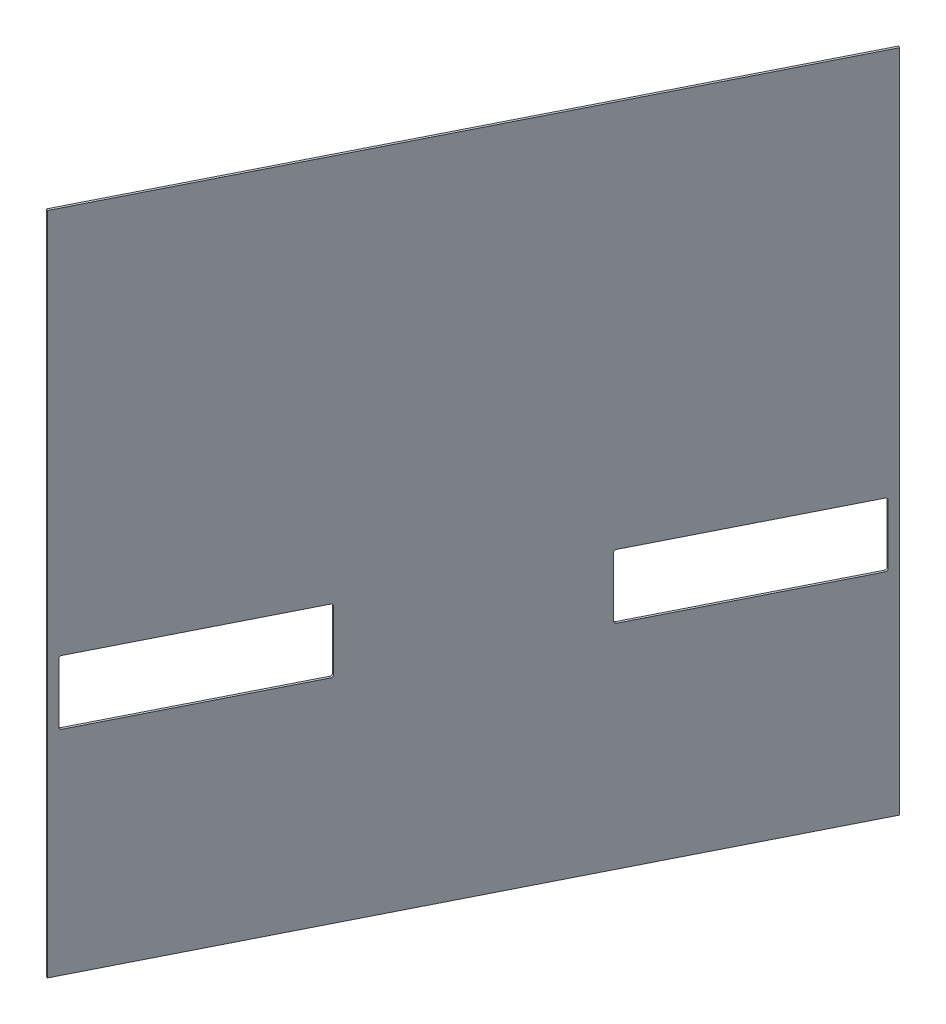
ISO-10303-21;
HEADER;
FILE_DESCRIPTION(('STEP AP214'),'2;1');
FILE_NAME('part.step','',(''),(''),'','','');
FILE_SCHEMA(('AUTOMOTIVE_DESIGN { 1 0 10303 214 1 1 1 1 }'));
ENDSEC;
DATA;
#1=APPLICATION_CONTEXT('core data for automotive mechanical design processes');
#2=APPLICATION_PROTOCOL_DEFINITION('international standard','automotive_design',2000,#1);
#3=PRODUCT_CONTEXT('',#1,'mechanical');
#4=PRODUCT('Part','Part','',(#3));
#5=PRODUCT_RELATED_PRODUCT_CATEGORY('part','',(#4));
#6=PRODUCT_DEFINITION_FORMATION('','',#4);
#7=PRODUCT_DEFINITION_CONTEXT('part definition',#1,'design');
#8=PRODUCT_DEFINITION('design','',#6,#7);
#9=PRODUCT_DEFINITION_SHAPE('','',#8);
#10=(LENGTH_UNIT() NAMED_UNIT(*) SI_UNIT(.MILLI.,.METRE.));
#11=(NAMED_UNIT(*) PLANE_ANGLE_UNIT() SI_UNIT($,.RADIAN.));
#12=(NAMED_UNIT(*) SI_UNIT($,.STERADIAN.) SOLID_ANGLE_UNIT());
#13=UNCERTAINTY_MEASURE_WITH_UNIT(LENGTH_MEASURE(1.E-05),#10,'distance_accuracy_value','');
#14=(GEOMETRIC_REPRESENTATION_CONTEXT(3) GLOBAL_UNCERTAINTY_ASSIGNED_CONTEXT((#13)) GLOBAL_UNIT_ASSIGNED_CONTEXT((#10,
#11,#12)) REPRESENTATION_CONTEXT('',''));
#15=CARTESIAN_POINT('',(0.,0.,0.));
#16=DIRECTION('',(0.,0.,1.));
#17=DIRECTION('',(1.,0.,0.));
#18=AXIS2_PLACEMENT_3D('',#15,#16,#17);
#19=CARTESIAN_POINT('',(-4206.67465586528,6.34999999999986,-7750.89939772489));
#20=DIRECTION('',(0.,-1.,0.));
#21=DIRECTION('',(0.,0.,-1.));
#22=AXIS2_PLACEMENT_3D('',#19,#20,#21);
#23=PLANE('',#22);
#24=DIRECTION('',(0.893517841167983,0.,0.449027691255792));
#25=VECTOR('',#24,1.);
#26=CARTESIAN_POINT('',(-4206.67465586528,6.34999999999986,-7750.89939772489));
#27=LINE('',#26,#25);
#28=CARTESIAN_POINT('',(-1758.70437432777,6.34999999999986,-6520.69850733782));
#29=VERTEX_POINT('',#28);
#30=CARTESIAN_POINT('',(-1753.03053603635,6.34999999999986,-6517.84718149835));
#31=VERTEX_POINT('',#30);
#32=EDGE_CURVE('E235',#29,#31,#27,.T.);
#33=ORIENTED_EDGE('',*,*,#32,.F.);
#34=DIRECTION('',(0.449027691255792,0.,-0.893517841167983));
#35=VECTOR('',#34,1.);
#36=CARTESIAN_POINT('',(-1758.70437432777,6.34999999999986,-6520.69850733782));
#37=LINE('',#36,#35);
#38=CARTESIAN_POINT('',(-909.009274164434,6.34999999999986,-8211.50231818));
#39=VERTEX_POINT('',#38);
#40=EDGE_CURVE('E146',#29,#39,#37,.T.);
#41=ORIENTED_EDGE('',*,*,#40,.T.);
#42=DIRECTION('',(0.893517841167983,0.,0.449027691255792));
#43=VECTOR('',#42,1.);
#44=CARTESIAN_POINT('',(-3356.97955570195,6.34999999999986,-9441.70320856706));
#45=LINE('',#44,#43);
#46=CARTESIAN_POINT('',(-903.335435873017,6.34999999999986,-8208.65099234052));
#47=VERTEX_POINT('',#46);
#48=EDGE_CURVE('E231',#39,#47,#45,.T.);
#49=ORIENTED_EDGE('',*,*,#48,.T.);
#50=DIRECTION('',(0.449027691255792,0.,-0.893517841167983));
#51=VECTOR('',#50,1.);
#52=CARTESIAN_POINT('',(-1753.03053603635,6.34999999999986,-6517.84718149835));
#53=LINE('',#52,#51);
#54=EDGE_CURVE('E180',#31,#47,#53,.T.);
#55=ORIENTED_EDGE('',*,*,#54,.F.);
#56=EDGE_LOOP('',(#33,#41,#49,#55));
#57=FACE_BOUND('',#56,.T.);
#58=ADVANCED_FACE('F33',(#57),#23,.T.);
#59=CARTESIAN_POINT('',(-4206.67465586528,1987.55,-7750.89939772489));
#60=DIRECTION('',(-0.449027691255792,0.,0.893517841167983));
#61=DIRECTION('',(0.893517841167983,0.,0.449027691255792));
#62=AXIS2_PLACEMENT_3D('',#59,#60,#61);
#63=PLANE('',#62);
#64=DIRECTION('',(0.893517841167983,0.,0.449027691255792));
#65=VECTOR('',#64,1.);
#66=CARTESIAN_POINT('',(-4206.67465586528,1987.55,-7750.89939772489));
#67=LINE('',#66,#65);
#68=CARTESIAN_POINT('',(-1758.70437432777,1987.55,-6520.69850733782));
#69=VERTEX_POINT('',#68);
#70=CARTESIAN_POINT('',(-1753.03053603635,1987.55,-6517.84718149835));
#71=VERTEX_POINT('',#70);
#72=EDGE_CURVE('E190',#69,#71,#67,.T.);
#73=ORIENTED_EDGE('',*,*,#72,.F.);
#74=DIRECTION('',(0.,-1.,0.));
#75=VECTOR('',#74,1.);
#76=CARTESIAN_POINT('',(-1758.70437432777,1987.55,-6520.69850733782));
#77=LINE('',#76,#75);
#78=EDGE_CURVE('E232',#69,#29,#77,.T.);
#79=ORIENTED_EDGE('',*,*,#78,.T.);
#80=ORIENTED_EDGE('',*,*,#32,.T.);
#81=DIRECTION('',(0.,-1.,0.));
#82=VECTOR('',#81,1.);
#83=CARTESIAN_POINT('',(-1753.03053603635,1987.55,-6517.84718149835));
#84=LINE('',#83,#82);
#85=EDGE_CURVE('E215',#71,#31,#84,.T.);
#86=ORIENTED_EDGE('',*,*,#85,.F.);
#87=EDGE_LOOP('',(#73,#79,#80,#86));
#88=FACE_BOUND('',#87,.T.);
#89=ADVANCED_FACE('F329',(#88),#63,.T.);
#90=CARTESIAN_POINT('',(-3781.82710578362,1987.55,-8596.30130314597));
#91=DIRECTION('',(0.,1.,0.));
#92=DIRECTION('',(0.,0.,1.));
#93=AXIS2_PLACEMENT_3D('',#90,#91,#92);
#94=PLANE('',#93);
#95=DIRECTION('',(0.893517841167983,0.,0.449027691255792));
#96=VECTOR('',#95,1.);
#97=CARTESIAN_POINT('',(-3356.97955570195,1987.55,-9441.70320856706));
#98=LINE('',#97,#96);
#99=CARTESIAN_POINT('',(-909.009274164435,1987.55,-8211.50231818));
#100=VERTEX_POINT('',#99);
#101=CARTESIAN_POINT('',(-903.335435873017,1987.55,-8208.65099234052));
#102=VERTEX_POINT('',#101);
#103=EDGE_CURVE('E189',#100,#102,#98,.T.);
#104=ORIENTED_EDGE('',*,*,#103,.F.);
#105=DIRECTION('',(-0.449027691255792,0.,0.893517841167983));
#106=VECTOR('',#105,1.);
#107=CARTESIAN_POINT('',(-1333.8568242461,1987.55,-7366.10041275891));
#108=LINE('',#107,#106);
#109=EDGE_CURVE('E236',#100,#69,#108,.T.);
#110=ORIENTED_EDGE('',*,*,#109,.T.);
#111=ORIENTED_EDGE('',*,*,#72,.T.);
#112=DIRECTION('',(-0.449027691255792,0.,0.893517841167983));
#113=VECTOR('',#112,1.);
#114=CARTESIAN_POINT('',(-1328.18298595468,1987.55,-7363.24908691944));
#115=LINE('',#114,#113);
#116=EDGE_CURVE('E311',#102,#71,#115,.T.);
#117=ORIENTED_EDGE('',*,*,#116,.F.);
#118=EDGE_LOOP('',(#104,#110,#111,#117));
#119=FACE_BOUND('',#118,.T.);
#120=ADVANCED_FACE('F328',(#119),#94,.T.);
#121=CARTESIAN_POINT('',(-3356.97955570195,6.34999999999986,-9441.70320856706));
#122=DIRECTION('',(0.449027691255792,0.,-0.893517841167983));
#123=DIRECTION('',(-0.893517841167983,0.,-0.449027691255792));
#124=AXIS2_PLACEMENT_3D('',#121,#122,#123);
#125=PLANE('',#124);
#126=ORIENTED_EDGE('',*,*,#48,.F.);
#127=DIRECTION('',(0.,1.,0.));
#128=VECTOR('',#127,1.);
#129=CARTESIAN_POINT('',(-909.009274164434,6.34999999999986,-8211.50231818));
#130=LINE('',#129,#128);
#131=EDGE_CURVE('E52',#39,#100,#130,.T.);
#132=ORIENTED_EDGE('',*,*,#131,.T.);
#133=ORIENTED_EDGE('',*,*,#103,.T.);
#134=DIRECTION('',(0.,1.,0.));
#135=VECTOR('',#134,1.);
#136=CARTESIAN_POINT('',(-903.335435873017,6.34999999999986,-8208.65099234052));
#137=LINE('',#136,#135);
#138=EDGE_CURVE('E183',#47,#102,#137,.T.);
#139=ORIENTED_EDGE('',*,*,#138,.F.);
#140=EDGE_LOOP('',(#126,#132,#133,#139));
#141=FACE_BOUND('',#140,.T.);
#142=ADVANCED_FACE('F325',(#141),#125,.T.);
#143=CARTESIAN_POINT('',(-3639.2608138099,647.7,-8879.99321771681));
#144=DIRECTION('',(0.893517841167983,0.,0.449027691255792));
#145=DIRECTION('',(0.449027691255792,0.,-0.893517841167983));
#146=AXIS2_PLACEMENT_3D('',#143,#144,#145);
#147=CYLINDRICAL_SURFACE('',#146,6.35000000000012);
#148=CARTESIAN_POINT('',(-1191.29053227239,647.7,-7649.79232732974));
#149=DIRECTION('',(-0.893517841167983,0.,-0.449027691255792));
#150=DIRECTION('',(-0.449027691255792,0.,0.893517841167983));
#151=AXIS2_PLACEMENT_3D('',#148,#149,#150);
#152=CIRCLE('',#151,6.35000000000012);
#153=CARTESIAN_POINT('',(-1194.14185811186,647.7,-7644.11848903833));
#154=VERTEX_POINT('',#153);
#155=CARTESIAN_POINT('',(-1191.29053227239,641.35,-7649.79232732974));
#156=VERTEX_POINT('',#155);
#157=EDGE_CURVE('E191',#154,#156,#152,.F.);
#158=ORIENTED_EDGE('',*,*,#157,.F.);
#159=DIRECTION('',(0.893517841167983,0.,0.449027691255792));
#160=VECTOR('',#159,1.);
#161=CARTESIAN_POINT('',(-3642.11213964938,647.7,-8874.31937942539));
#162=LINE('',#161,#160);
#163=CARTESIAN_POINT('',(-1188.46801982045,647.7,-7641.26716319885));
#164=VERTEX_POINT('',#163);
#165=EDGE_CURVE('E245',#154,#164,#162,.T.);
#166=ORIENTED_EDGE('',*,*,#165,.T.);
#167=CARTESIAN_POINT('',(-1185.61669398097,647.7,-7646.94100149027));
#168=DIRECTION('',(0.893517841167983,0.,0.449027691255792));
#169=DIRECTION('',(0.449027691255792,0.,-0.893517841167983));
#170=AXIS2_PLACEMENT_3D('',#167,#168,#169);
#171=CIRCLE('',#170,6.35000000000012);
#172=CARTESIAN_POINT('',(-1185.61669398097,641.35,-7646.94100149027));
#173=VERTEX_POINT('',#172);
#174=EDGE_CURVE('E248',#164,#173,#171,.T.);
#175=ORIENTED_EDGE('',*,*,#174,.T.);
#176=DIRECTION('',(0.893517841167983,0.,0.449027691255792));
#177=VECTOR('',#176,1.);
#178=CARTESIAN_POINT('',(-3639.2608138099,641.35,-8879.99321771681));
#179=LINE('',#178,#177);
#180=EDGE_CURVE('E75',#156,#173,#179,.T.);
#181=ORIENTED_EDGE('',*,*,#180,.F.);
#182=EDGE_LOOP('',(#158,#166,#175,#181));
#183=FACE_BOUND('',#182,.T.);
#184=ADVANCED_FACE('F353',(#183),#147,.F.);
#185=CARTESIAN_POINT('',(-3642.11213964938,825.5,-8874.31937942539));
#186=DIRECTION('',(-0.449027691255792,0.,0.893517841167983));
#187=DIRECTION('',(0.893517841167983,0.,0.449027691255792));
#188=AXIS2_PLACEMENT_3D('',#185,#186,#187);
#189=PLANE('',#188);
#190=DIRECTION('',(0.,-1.,0.));
#191=VECTOR('',#190,1.);
#192=CARTESIAN_POINT('',(-1194.14185811186,825.5,-7644.11848903833));
#193=LINE('',#192,#191);
#194=CARTESIAN_POINT('',(-1194.14185811186,825.5,-7644.11848903833));
#195=VERTEX_POINT('',#194);
#196=EDGE_CURVE('E195',#195,#154,#193,.T.);
#197=ORIENTED_EDGE('',*,*,#196,.F.);
#198=DIRECTION('',(0.893517841167983,0.,0.449027691255792));
#199=VECTOR('',#198,1.);
#200=CARTESIAN_POINT('',(-3642.11213964938,825.5,-8874.31937942539));
#201=LINE('',#200,#199);
#202=CARTESIAN_POINT('',(-1188.46801982045,825.5,-7641.26716319885));
#203=VERTEX_POINT('',#202);
#204=EDGE_CURVE('E249',#195,#203,#201,.T.);
#205=ORIENTED_EDGE('',*,*,#204,.T.);
#206=DIRECTION('',(0.,-1.,0.));
#207=VECTOR('',#206,1.);
#208=CARTESIAN_POINT('',(-1188.46801982045,825.5,-7641.26716319885));
#209=LINE('',#208,#207);
#210=EDGE_CURVE('E251',#203,#164,#209,.T.);
#211=ORIENTED_EDGE('',*,*,#210,.T.);
#212=ORIENTED_EDGE('',*,*,#165,.F.);
#213=EDGE_LOOP('',(#197,#205,#211,#212));
#214=FACE_BOUND('',#213,.T.);
#215=ADVANCED_FACE('F341',(#214),#189,.F.);
#216=CARTESIAN_POINT('',(-3639.2608138099,825.5,-8879.99321771681));
#217=DIRECTION('',(0.893517841167983,0.,0.449027691255792));
#218=DIRECTION('',(0.449027691255792,0.,-0.893517841167983));
#219=AXIS2_PLACEMENT_3D('',#216,#217,#218);
#220=CYLINDRICAL_SURFACE('',#219,6.35);
#221=CARTESIAN_POINT('',(-1191.29053227239,825.5,-7649.79232732974));
#222=DIRECTION('',(-0.893517841167983,0.,-0.449027691255792));
#223=DIRECTION('',(-0.449027691255792,0.,0.893517841167983));
#224=AXIS2_PLACEMENT_3D('',#221,#222,#223);
#225=CIRCLE('',#224,6.35);
#226=CARTESIAN_POINT('',(-1191.29053227239,831.85,-7649.79232732974));
#227=VERTEX_POINT('',#226);
#228=EDGE_CURVE('E11',#227,#195,#225,.F.);
#229=ORIENTED_EDGE('',*,*,#228,.F.);
#230=DIRECTION('',(0.893517841167983,0.,0.449027691255792));
#231=VECTOR('',#230,1.);
#232=CARTESIAN_POINT('',(-3639.2608138099,831.85,-8879.99321771681));
#233=LINE('',#232,#231);
#234=CARTESIAN_POINT('',(-1185.61669398097,831.85,-7646.94100149027));
#235=VERTEX_POINT('',#234);
#236=EDGE_CURVE('E252',#227,#235,#233,.T.);
#237=ORIENTED_EDGE('',*,*,#236,.T.);
#238=CARTESIAN_POINT('',(-1185.61669398097,825.5,-7646.94100149027));
#239=DIRECTION('',(0.893517841167983,0.,0.449027691255792));
#240=DIRECTION('',(0.449027691255792,0.,-0.893517841167983));
#241=AXIS2_PLACEMENT_3D('',#238,#239,#240);
#242=CIRCLE('',#241,6.35);
#243=EDGE_CURVE('E254',#235,#203,#242,.T.);
#244=ORIENTED_EDGE('',*,*,#243,.T.);
#245=ORIENTED_EDGE('',*,*,#204,.F.);
#246=EDGE_LOOP('',(#229,#237,#244,#245));
#247=FACE_BOUND('',#246,.T.);
#248=ADVANCED_FACE('F344',(#247),#220,.F.);
#249=CARTESIAN_POINT('',(-3371.23618489932,831.85,-9413.33401710998));
#250=DIRECTION('',(0.,1.,0.));
#251=DIRECTION('',(0.,0.,1.));
#252=AXIS2_PLACEMENT_3D('',#249,#250,#251);
#253=PLANE('',#252);
#254=DIRECTION('',(-0.449027691255792,0.,0.893517841167983));
#255=VECTOR('',#254,1.);
#256=CARTESIAN_POINT('',(-923.265903361805,831.85,-8183.13312672291));
#257=LINE('',#256,#255);
#258=CARTESIAN_POINT('',(-923.265903361806,831.85,-8183.13312672291));
#259=VERTEX_POINT('',#258);
#260=EDGE_CURVE('E43',#259,#227,#257,.T.);
#261=ORIENTED_EDGE('',*,*,#260,.F.);
#262=DIRECTION('',(0.893517841167983,0.,0.449027691255792));
#263=VECTOR('',#262,1.);
#264=CARTESIAN_POINT('',(-3371.23618489932,831.85,-9413.33401710998));
#265=LINE('',#264,#263);
#266=CARTESIAN_POINT('',(-917.592065070389,831.85,-8180.28180088344));
#267=VERTEX_POINT('',#266);
#268=EDGE_CURVE('E255',#259,#267,#265,.T.);
#269=ORIENTED_EDGE('',*,*,#268,.T.);
#270=DIRECTION('',(-0.449027691255791,0.,0.893517841167984));
#271=VECTOR('',#270,1.);
#272=CARTESIAN_POINT('',(-917.592065070389,831.85,-8180.28180088344));
#273=LINE('',#272,#271);
#274=EDGE_CURVE('E257',#267,#235,#273,.T.);
#275=ORIENTED_EDGE('',*,*,#274,.T.);
#276=ORIENTED_EDGE('',*,*,#236,.F.);
#277=EDGE_LOOP('',(#261,#269,#275,#276));
#278=FACE_BOUND('',#277,.T.);
#279=ADVANCED_FACE('F424',(#278),#253,.F.);
#280=CARTESIAN_POINT('',(-3371.23618489932,825.5,-9413.33401710998));
#281=DIRECTION('',(0.893517841167983,0.,0.449027691255792));
#282=DIRECTION('',(0.449027691255792,0.,-0.893517841167983));
#283=AXIS2_PLACEMENT_3D('',#280,#281,#282);
#284=CYLINDRICAL_SURFACE('',#283,6.35000000000006);
#285=CARTESIAN_POINT('',(-923.265903361805,825.5,-8183.13312672291));
#286=DIRECTION('',(-0.893517841167983,0.,-0.449027691255792));
#287=DIRECTION('',(-0.449027691255792,0.,0.893517841167983));
#288=AXIS2_PLACEMENT_3D('',#285,#286,#287);
#289=CIRCLE('',#288,6.35000000000006);
#290=CARTESIAN_POINT('',(-920.414577522332,825.5,-8188.80696501433));
#291=VERTEX_POINT('',#290);
#292=EDGE_CURVE('E201',#291,#259,#289,.F.);
#293=ORIENTED_EDGE('',*,*,#292,.F.);
#294=DIRECTION('',(0.893517841167983,0.,0.449027691255792));
#295=VECTOR('',#294,1.);
#296=CARTESIAN_POINT('',(-3368.38485905985,825.5,-9419.00785540139));
#297=LINE('',#296,#295);
#298=CARTESIAN_POINT('',(-914.740739230914,825.5,-8185.95563917485));
#299=VERTEX_POINT('',#298);
#300=EDGE_CURVE('E258',#291,#299,#297,.T.);
#301=ORIENTED_EDGE('',*,*,#300,.T.);
#302=CARTESIAN_POINT('',(-917.592065070389,825.5,-8180.28180088344));
#303=DIRECTION('',(0.893517841167983,0.,0.449027691255792));
#304=DIRECTION('',(0.449027691255792,0.,-0.893517841167983));
#305=AXIS2_PLACEMENT_3D('',#302,#303,#304);
#306=CIRCLE('',#305,6.35000000000006);
#307=EDGE_CURVE('E260',#299,#267,#306,.T.);
#308=ORIENTED_EDGE('',*,*,#307,.T.);
#309=ORIENTED_EDGE('',*,*,#268,.F.);
#310=EDGE_LOOP('',(#293,#301,#308,#309));
#311=FACE_BOUND('',#310,.T.);
#312=ADVANCED_FACE('F369',(#311),#284,.F.);
#313=CARTESIAN_POINT('',(-3368.38485905985,647.7,-9419.00785540139));
#314=DIRECTION('',(0.449027691255792,0.,-0.893517841167983));
#315=DIRECTION('',(-0.893517841167983,0.,-0.449027691255792));
#316=AXIS2_PLACEMENT_3D('',#313,#314,#315);
#317=PLANE('',#316);
#318=DIRECTION('',(0.,1.,0.));
#319=VECTOR('',#318,1.);
#320=CARTESIAN_POINT('',(-920.414577522331,647.7,-8188.80696501433));
#321=LINE('',#320,#319);
#322=CARTESIAN_POINT('',(-920.414577522331,647.7,-8188.80696501433));
#323=VERTEX_POINT('',#322);
#324=EDGE_CURVE('E204',#323,#291,#321,.T.);
#325=ORIENTED_EDGE('',*,*,#324,.F.);
#326=DIRECTION('',(0.893517841167983,0.,0.449027691255792));
#327=VECTOR('',#326,1.);
#328=CARTESIAN_POINT('',(-3368.38485905985,647.7,-9419.00785540139));
#329=LINE('',#328,#327);
#330=CARTESIAN_POINT('',(-914.740739230914,647.7,-8185.95563917485));
#331=VERTEX_POINT('',#330);
#332=EDGE_CURVE('E261',#323,#331,#329,.T.);
#333=ORIENTED_EDGE('',*,*,#332,.T.);
#334=DIRECTION('',(0.,1.,0.));
#335=VECTOR('',#334,1.);
#336=CARTESIAN_POINT('',(-914.740739230914,647.7,-8185.95563917485));
#337=LINE('',#336,#335);
#338=EDGE_CURVE('E263',#331,#299,#337,.T.);
#339=ORIENTED_EDGE('',*,*,#338,.T.);
#340=ORIENTED_EDGE('',*,*,#300,.F.);
#341=EDGE_LOOP('',(#325,#333,#339,#340));
#342=FACE_BOUND('',#341,.T.);
#343=ADVANCED_FACE('F363',(#342),#317,.F.);
#344=CARTESIAN_POINT('',(-3371.23618489932,647.7,-9413.33401710998));
#345=DIRECTION('',(0.893517841167983,0.,0.449027691255792));
#346=DIRECTION('',(0.449027691255792,0.,-0.893517841167983));
#347=AXIS2_PLACEMENT_3D('',#344,#345,#346);
#348=CYLINDRICAL_SURFACE('',#347,6.35000000000006);
#349=CARTESIAN_POINT('',(-923.265903361805,647.7,-8183.13312672291));
#350=DIRECTION('',(-0.893517841167983,0.,-0.449027691255792));
#351=DIRECTION('',(-0.449027691255792,0.,0.893517841167983));
#352=AXIS2_PLACEMENT_3D('',#349,#350,#351);
#353=CIRCLE('',#352,6.35000000000006);
#354=CARTESIAN_POINT('',(-923.265903361805,641.35,-8183.13312672291));
#355=VERTEX_POINT('',#354);
#356=EDGE_CURVE('E207',#355,#323,#353,.F.);
#357=ORIENTED_EDGE('',*,*,#356,.F.);
#358=DIRECTION('',(0.893517841167983,0.,0.449027691255792));
#359=VECTOR('',#358,1.);
#360=CARTESIAN_POINT('',(-3371.23618489932,641.35,-9413.33401710998));
#361=LINE('',#360,#359);
#362=CARTESIAN_POINT('',(-917.592065070389,641.35,-8180.28180088344));
#363=VERTEX_POINT('',#362);
#364=EDGE_CURVE('E66',#355,#363,#361,.T.);
#365=ORIENTED_EDGE('',*,*,#364,.T.);
#366=CARTESIAN_POINT('',(-917.592065070389,647.7,-8180.28180088344));
#367=DIRECTION('',(0.893517841167983,0.,0.449027691255792));
#368=DIRECTION('',(0.449027691255792,0.,-0.893517841167983));
#369=AXIS2_PLACEMENT_3D('',#366,#367,#368);
#370=CIRCLE('',#369,6.35000000000006);
#371=EDGE_CURVE('E265',#363,#331,#370,.T.);
#372=ORIENTED_EDGE('',*,*,#371,.T.);
#373=ORIENTED_EDGE('',*,*,#332,.F.);
#374=EDGE_LOOP('',(#357,#365,#372,#373));
#375=FACE_BOUND('',#374,.T.);
#376=ADVANCED_FACE('F360',(#375),#348,.F.);
#377=CARTESIAN_POINT('',(-3639.2608138099,641.35,-8879.99321771681));
#378=DIRECTION('',(0.,-1.,0.));
#379=DIRECTION('',(0.,0.,-1.));
#380=AXIS2_PLACEMENT_3D('',#377,#378,#379);
#381=PLANE('',#380);
#382=DIRECTION('',(0.449027691255792,0.,-0.893517841167983));
#383=VECTOR('',#382,1.);
#384=CARTESIAN_POINT('',(-1191.29053227239,641.35,-7649.79232732974));
#385=LINE('',#384,#383);
#386=EDGE_CURVE('E194',#156,#355,#385,.T.);
#387=ORIENTED_EDGE('',*,*,#386,.F.);
#388=ORIENTED_EDGE('',*,*,#180,.T.);
#389=DIRECTION('',(0.449027691255791,0.,-0.893517841167984));
#390=VECTOR('',#389,1.);
#391=CARTESIAN_POINT('',(-1185.61669398097,641.35,-7646.94100149027));
#392=LINE('',#391,#390);
#393=EDGE_CURVE('E267',#173,#363,#392,.T.);
#394=ORIENTED_EDGE('',*,*,#393,.T.);
#395=ORIENTED_EDGE('',*,*,#364,.F.);
#396=EDGE_LOOP('',(#387,#388,#394,#395));
#397=FACE_BOUND('',#396,.T.);
#398=ADVANCED_FACE('F355',(#397),#381,.F.);
#399=CARTESIAN_POINT('',(-3924.39339775733,647.7,-8312.60938857514));
#400=DIRECTION('',(0.893517841167983,0.,0.449027691255792));
#401=DIRECTION('',(0.449027691255792,0.,-0.893517841167983));
#402=AXIS2_PLACEMENT_3D('',#399,#400,#401);
#403=CYLINDRICAL_SURFACE('',#402,6.35000000000006);
#404=CARTESIAN_POINT('',(-1476.42311621982,647.7,-7082.40849818807));
#405=DIRECTION('',(-0.893517841167983,0.,-0.449027691255792));
#406=DIRECTION('',(-0.449027691255792,0.,0.893517841167983));
#407=AXIS2_PLACEMENT_3D('',#404,#405,#406);
#408=CIRCLE('',#407,6.35000000000006);
#409=CARTESIAN_POINT('',(-1476.42311621982,641.35,-7082.40849818807));
#410=VERTEX_POINT('',#409);
#411=CARTESIAN_POINT('',(-1473.57179038034,647.7,-7088.08233647949));
#412=VERTEX_POINT('',#411);
#413=EDGE_CURVE('E210',#410,#412,#408,.F.);
#414=ORIENTED_EDGE('',*,*,#413,.F.);
#415=DIRECTION('',(0.893517841167983,0.,0.449027691255792));
#416=VECTOR('',#415,1.);
#417=CARTESIAN_POINT('',(-3924.39339775733,641.35,-8312.60938857514));
#418=LINE('',#417,#416);
#419=CARTESIAN_POINT('',(-1470.7492779284,641.35,-7079.5571723486));
#420=VERTEX_POINT('',#419);
#421=EDGE_CURVE('E170',#410,#420,#418,.T.);
#422=ORIENTED_EDGE('',*,*,#421,.T.);
#423=CARTESIAN_POINT('',(-1470.7492779284,647.7,-7079.5571723486));
#424=DIRECTION('',(0.893517841167983,0.,0.449027691255792));
#425=DIRECTION('',(0.449027691255792,0.,-0.893517841167983));
#426=AXIS2_PLACEMENT_3D('',#423,#424,#425);
#427=CIRCLE('',#426,6.35000000000006);
#428=CARTESIAN_POINT('',(-1467.89795208892,647.7,-7085.23101064002));
#429=VERTEX_POINT('',#428);
#430=EDGE_CURVE('E167',#420,#429,#427,.T.);
#431=ORIENTED_EDGE('',*,*,#430,.T.);
#432=DIRECTION('',(0.893517841167983,0.,0.449027691255792));
#433=VECTOR('',#432,1.);
#434=CARTESIAN_POINT('',(-3921.54207191786,647.7,-8318.28322686656));
#435=LINE('',#434,#433);
#436=EDGE_CURVE('E37',#412,#429,#435,.T.);
#437=ORIENTED_EDGE('',*,*,#436,.F.);
#438=EDGE_LOOP('',(#414,#422,#431,#437));
#439=FACE_BOUND('',#438,.T.);
#440=ADVANCED_FACE('F168',(#439),#403,.F.);
#441=CARTESIAN_POINT('',(-4192.41802666791,641.35,-7779.26858918197));
#442=DIRECTION('',(0.,-1.,0.));
#443=DIRECTION('',(0.,0.,-1.));
#444=AXIS2_PLACEMENT_3D('',#441,#442,#443);
#445=PLANE('',#444);
#446=DIRECTION('',(0.449027691255792,0.,-0.893517841167983));
#447=VECTOR('',#446,1.);
#448=CARTESIAN_POINT('',(-1744.4477451304,641.35,-6549.06769879491));
#449=LINE('',#448,#447);
#450=CARTESIAN_POINT('',(-1744.4477451304,641.35,-6549.06769879491));
#451=VERTEX_POINT('',#450);
#452=EDGE_CURVE('E212',#451,#410,#449,.T.);
#453=ORIENTED_EDGE('',*,*,#452,.F.);
#454=DIRECTION('',(0.893517841167983,0.,0.449027691255792));
#455=VECTOR('',#454,1.);
#456=CARTESIAN_POINT('',(-4192.41802666791,641.35,-7779.26858918197));
#457=LINE('',#456,#455);
#458=CARTESIAN_POINT('',(-1738.77390683898,641.35,-6546.21637295543));
#459=VERTEX_POINT('',#458);
#460=EDGE_CURVE('E174',#451,#459,#457,.T.);
#461=ORIENTED_EDGE('',*,*,#460,.T.);
#462=DIRECTION('',(0.449027691255792,0.,-0.893517841167983));
#463=VECTOR('',#462,1.);
#464=CARTESIAN_POINT('',(-1738.77390683898,641.35,-6546.21637295543));
#465=LINE('',#464,#463);
#466=EDGE_CURVE('E270',#459,#420,#465,.T.);
#467=ORIENTED_EDGE('',*,*,#466,.T.);
#468=ORIENTED_EDGE('',*,*,#421,.F.);
#469=EDGE_LOOP('',(#453,#461,#467,#468));
#470=FACE_BOUND('',#469,.T.);
#471=ADVANCED_FACE('F388',(#470),#445,.F.);
#472=CARTESIAN_POINT('',(-4192.41802666791,647.7,-7779.26858918197));
#473=DIRECTION('',(0.893517841167983,0.,0.449027691255792));
#474=DIRECTION('',(0.449027691255792,0.,-0.893517841167983));
#475=AXIS2_PLACEMENT_3D('',#472,#473,#474);
#476=CYLINDRICAL_SURFACE('',#475,6.34999999999996);
#477=CARTESIAN_POINT('',(-1744.4477451304,647.7,-6549.06769879491));
#478=DIRECTION('',(-0.893517841167983,0.,-0.449027691255792));
#479=DIRECTION('',(-0.449027691255792,0.,0.893517841167983));
#480=AXIS2_PLACEMENT_3D('',#477,#478,#479);
#481=CIRCLE('',#480,6.34999999999996);
#482=CARTESIAN_POINT('',(-1747.29907096987,647.7,-6543.39386050349));
#483=VERTEX_POINT('',#482);
#484=EDGE_CURVE('E197',#483,#451,#481,.F.);
#485=ORIENTED_EDGE('',*,*,#484,.F.);
#486=DIRECTION('',(0.893517841167983,0.,0.449027691255792));
#487=VECTOR('',#486,1.);
#488=CARTESIAN_POINT('',(-4195.26935250739,647.7,-7773.59475089056));
#489=LINE('',#488,#487);
#490=CARTESIAN_POINT('',(-1741.62523267846,647.7,-6540.54253466401));
#491=VERTEX_POINT('',#490);
#492=EDGE_CURVE('E271',#483,#491,#489,.T.);
#493=ORIENTED_EDGE('',*,*,#492,.T.);
#494=CARTESIAN_POINT('',(-1738.77390683898,647.7,-6546.21637295543));
#495=DIRECTION('',(0.893517841167983,0.,0.449027691255792));
#496=DIRECTION('',(0.449027691255792,0.,-0.893517841167983));
#497=AXIS2_PLACEMENT_3D('',#494,#495,#496);
#498=CIRCLE('',#497,6.34999999999996);
#499=EDGE_CURVE('E273',#491,#459,#498,.T.);
#500=ORIENTED_EDGE('',*,*,#499,.T.);
#501=ORIENTED_EDGE('',*,*,#460,.F.);
#502=EDGE_LOOP('',(#485,#493,#500,#501));
#503=FACE_BOUND('',#502,.T.);
#504=ADVANCED_FACE('F393',(#503),#476,.F.);
#505=CARTESIAN_POINT('',(-4195.26935250739,825.5,-7773.59475089056));
#506=DIRECTION('',(-0.449027691255792,0.,0.893517841167983));
#507=DIRECTION('',(0.893517841167983,0.,0.449027691255792));
#508=AXIS2_PLACEMENT_3D('',#505,#506,#507);
#509=PLANE('',#508);
#510=DIRECTION('',(0.,-1.,0.));
#511=VECTOR('',#510,1.);
#512=CARTESIAN_POINT('',(-1747.29907096987,825.5,-6543.39386050349));
#513=LINE('',#512,#511);
#514=CARTESIAN_POINT('',(-1747.29907096987,825.5,-6543.39386050349));
#515=VERTEX_POINT('',#514);
#516=EDGE_CURVE('E218',#515,#483,#513,.T.);
#517=ORIENTED_EDGE('',*,*,#516,.F.);
#518=DIRECTION('',(0.893517841167983,0.,0.449027691255792));
#519=VECTOR('',#518,1.);
#520=CARTESIAN_POINT('',(-4195.26935250739,825.5,-7773.59475089056));
#521=LINE('',#520,#519);
#522=CARTESIAN_POINT('',(-1741.62523267846,825.5,-6540.54253466401));
#523=VERTEX_POINT('',#522);
#524=EDGE_CURVE('E274',#515,#523,#521,.T.);
#525=ORIENTED_EDGE('',*,*,#524,.T.);
#526=DIRECTION('',(0.,-1.,0.));
#527=VECTOR('',#526,1.);
#528=CARTESIAN_POINT('',(-1741.62523267846,825.5,-6540.54253466401));
#529=LINE('',#528,#527);
#530=EDGE_CURVE('E276',#523,#491,#529,.T.);
#531=ORIENTED_EDGE('',*,*,#530,.T.);
#532=ORIENTED_EDGE('',*,*,#492,.F.);
#533=EDGE_LOOP('',(#517,#525,#531,#532));
#534=FACE_BOUND('',#533,.T.);
#535=ADVANCED_FACE('F396',(#534),#509,.F.);
#536=CARTESIAN_POINT('',(-4192.41802666791,825.5,-7779.26858918197));
#537=DIRECTION('',(0.893517841167983,0.,0.449027691255792));
#538=DIRECTION('',(0.449027691255792,0.,-0.893517841167983));
#539=AXIS2_PLACEMENT_3D('',#536,#537,#538);
#540=CYLINDRICAL_SURFACE('',#539,6.34999999999996);
#541=CARTESIAN_POINT('',(-1744.4477451304,825.5,-6549.06769879491));
#542=DIRECTION('',(-0.893517841167983,0.,-0.449027691255792));
#543=DIRECTION('',(-0.449027691255792,0.,0.893517841167983));
#544=AXIS2_PLACEMENT_3D('',#541,#542,#543);
#545=CIRCLE('',#544,6.34999999999996);
#546=CARTESIAN_POINT('',(-1744.4477451304,831.85,-6549.06769879491));
#547=VERTEX_POINT('',#546);
#548=EDGE_CURVE('E221',#547,#515,#545,.F.);
#549=ORIENTED_EDGE('',*,*,#548,.F.);
#550=DIRECTION('',(0.893517841167983,0.,0.449027691255792));
#551=VECTOR('',#550,1.);
#552=CARTESIAN_POINT('',(-4192.41802666791,831.85,-7779.26858918197));
#553=LINE('',#552,#551);
#554=CARTESIAN_POINT('',(-1738.77390683898,831.85,-6546.21637295543));
#555=VERTEX_POINT('',#554);
#556=EDGE_CURVE('E277',#547,#555,#553,.T.);
#557=ORIENTED_EDGE('',*,*,#556,.T.);
#558=CARTESIAN_POINT('',(-1738.77390683898,825.5,-6546.21637295543));
#559=DIRECTION('',(0.893517841167983,0.,0.449027691255792));
#560=DIRECTION('',(0.449027691255792,0.,-0.893517841167983));
#561=AXIS2_PLACEMENT_3D('',#558,#559,#560);
#562=CIRCLE('',#561,6.34999999999996);
#563=EDGE_CURVE('E279',#555,#523,#562,.T.);
#564=ORIENTED_EDGE('',*,*,#563,.T.);
#565=ORIENTED_EDGE('',*,*,#524,.F.);
#566=EDGE_LOOP('',(#549,#557,#564,#565));
#567=FACE_BOUND('',#566,.T.);
#568=ADVANCED_FACE('F399',(#567),#540,.F.);
#569=CARTESIAN_POINT('',(-3924.39339775733,831.85,-8312.60938857514));
#570=DIRECTION('',(0.,1.,0.));
#571=DIRECTION('',(0.,0.,1.));
#572=AXIS2_PLACEMENT_3D('',#569,#570,#571);
#573=PLANE('',#572);
#574=DIRECTION('',(-0.449027691255792,0.,0.893517841167983));
#575=VECTOR('',#574,1.);
#576=CARTESIAN_POINT('',(-1476.42311621981,831.85,-7082.40849818807));
#577=LINE('',#576,#575);
#578=CARTESIAN_POINT('',(-1476.42311621982,831.85,-7082.40849818807));
#579=VERTEX_POINT('',#578);
#580=EDGE_CURVE('E224',#579,#547,#577,.T.);
#581=ORIENTED_EDGE('',*,*,#580,.F.);
#582=DIRECTION('',(0.893517841167983,0.,0.449027691255792));
#583=VECTOR('',#582,1.);
#584=CARTESIAN_POINT('',(-3924.39339775733,831.85,-8312.60938857514));
#585=LINE('',#584,#583);
#586=CARTESIAN_POINT('',(-1470.7492779284,831.85,-7079.5571723486));
#587=VERTEX_POINT('',#586);
#588=EDGE_CURVE('E280',#579,#587,#585,.T.);
#589=ORIENTED_EDGE('',*,*,#588,.T.);
#590=DIRECTION('',(-0.449027691255792,0.,0.893517841167983));
#591=VECTOR('',#590,1.);
#592=CARTESIAN_POINT('',(-1470.7492779284,831.85,-7079.5571723486));
#593=LINE('',#592,#591);
#594=EDGE_CURVE('E281',#587,#555,#593,.T.);
#595=ORIENTED_EDGE('',*,*,#594,.T.);
#596=ORIENTED_EDGE('',*,*,#556,.F.);
#597=EDGE_LOOP('',(#581,#589,#595,#596));
#598=FACE_BOUND('',#597,.T.);
#599=ADVANCED_FACE('F384',(#598),#573,.F.);
#600=CARTESIAN_POINT('',(-3924.39339775733,825.5,-8312.60938857514));
#601=DIRECTION('',(0.893517841167983,0.,0.449027691255792));
#602=DIRECTION('',(0.449027691255792,0.,-0.893517841167983));
#603=AXIS2_PLACEMENT_3D('',#600,#601,#602);
#604=CYLINDRICAL_SURFACE('',#603,6.35);
#605=CARTESIAN_POINT('',(-1476.42311621982,825.5,-7082.40849818807));
#606=DIRECTION('',(-0.893517841167983,0.,-0.449027691255792));
#607=DIRECTION('',(-0.449027691255792,0.,0.893517841167983));
#608=AXIS2_PLACEMENT_3D('',#605,#606,#607);
#609=CIRCLE('',#608,6.35);
#610=CARTESIAN_POINT('',(-1473.57179038034,825.5,-7088.08233647949));
#611=VERTEX_POINT('',#610);
#612=EDGE_CURVE('E227',#611,#579,#609,.F.);
#613=ORIENTED_EDGE('',*,*,#612,.F.);
#614=DIRECTION('',(0.893517841167983,0.,0.449027691255792));
#615=VECTOR('',#614,1.);
#616=CARTESIAN_POINT('',(-3921.54207191786,825.5,-8318.28322686656));
#617=LINE('',#616,#615);
#618=CARTESIAN_POINT('',(-1467.89795208892,825.5,-7085.23101064002));
#619=VERTEX_POINT('',#618);
#620=EDGE_CURVE('E152',#611,#619,#617,.T.);
#621=ORIENTED_EDGE('',*,*,#620,.T.);
#622=CARTESIAN_POINT('',(-1470.7492779284,825.5,-7079.5571723486));
#623=DIRECTION('',(0.893517841167983,0.,0.449027691255792));
#624=DIRECTION('',(0.449027691255792,0.,-0.893517841167983));
#625=AXIS2_PLACEMENT_3D('',#622,#623,#624);
#626=CIRCLE('',#625,6.35);
#627=EDGE_CURVE('E165',#619,#587,#626,.T.);
#628=ORIENTED_EDGE('',*,*,#627,.T.);
#629=ORIENTED_EDGE('',*,*,#588,.F.);
#630=EDGE_LOOP('',(#613,#621,#628,#629));
#631=FACE_BOUND('',#630,.T.);
#632=ADVANCED_FACE('F385',(#631),#604,.F.);
#633=CARTESIAN_POINT('',(-3921.54207191786,647.7,-8318.28322686656));
#634=DIRECTION('',(0.449027691255792,0.,-0.893517841167983));
#635=DIRECTION('',(-0.893517841167983,0.,-0.449027691255792));
#636=AXIS2_PLACEMENT_3D('',#633,#634,#635);
#637=PLANE('',#636);
#638=DIRECTION('',(0.,1.,0.));
#639=VECTOR('',#638,1.);
#640=CARTESIAN_POINT('',(-1473.57179038034,647.7,-7088.08233647949));
#641=LINE('',#640,#639);
#642=EDGE_CURVE('E162',#412,#611,#641,.T.);
#643=ORIENTED_EDGE('',*,*,#642,.F.);
#644=ORIENTED_EDGE('',*,*,#436,.T.);
#645=DIRECTION('',(0.,1.,0.));
#646=VECTOR('',#645,1.);
#647=CARTESIAN_POINT('',(-1467.89795208892,647.7,-7085.23101064002));
#648=LINE('',#647,#646);
#649=EDGE_CURVE('E159',#429,#619,#648,.T.);
#650=ORIENTED_EDGE('',*,*,#649,.T.);
#651=ORIENTED_EDGE('',*,*,#620,.F.);
#652=EDGE_LOOP('',(#643,#644,#650,#651));
#653=FACE_BOUND('',#652,.T.);
#654=ADVANCED_FACE('F157',(#653),#637,.F.);
#655=CARTESIAN_POINT('',(-4014.62742357812,0.,-2017.50742985172));
#656=DIRECTION('',(0.893517841167983,0.,0.449027691255792));
#657=DIRECTION('',(0.449027691255792,0.,-0.893517841167983));
#658=AXIS2_PLACEMENT_3D('',#655,#656,#657);
#659=PLANE('',#658);
#660=ORIENTED_EDGE('',*,*,#430,.F.);
#661=ORIENTED_EDGE('',*,*,#466,.F.);
#662=ORIENTED_EDGE('',*,*,#499,.F.);
#663=ORIENTED_EDGE('',*,*,#530,.F.);
#664=ORIENTED_EDGE('',*,*,#563,.F.);
#665=ORIENTED_EDGE('',*,*,#594,.F.);
#666=ORIENTED_EDGE('',*,*,#627,.F.);
#667=ORIENTED_EDGE('',*,*,#649,.F.);
#668=EDGE_LOOP('',(#660,#661,#662,#663,#664,#665,#666,#667));
#669=FACE_BOUND('',#668,.T.);
#670=ORIENTED_EDGE('',*,*,#174,.F.);
#671=ORIENTED_EDGE('',*,*,#210,.F.);
#672=ORIENTED_EDGE('',*,*,#243,.F.);
#673=ORIENTED_EDGE('',*,*,#274,.F.);
#674=ORIENTED_EDGE('',*,*,#307,.F.);
#675=ORIENTED_EDGE('',*,*,#338,.F.);
#676=ORIENTED_EDGE('',*,*,#371,.F.);
#677=ORIENTED_EDGE('',*,*,#393,.F.);
#678=EDGE_LOOP('',(#670,#671,#672,#673,#674,#675,#676,#677));
#679=FACE_BOUND('',#678,.T.);
#680=ORIENTED_EDGE('',*,*,#54,.T.);
#681=ORIENTED_EDGE('',*,*,#138,.T.);
#682=ORIENTED_EDGE('',*,*,#116,.T.);
#683=ORIENTED_EDGE('',*,*,#85,.T.);
#684=EDGE_LOOP('',(#680,#681,#682,#683));
#685=FACE_BOUND('',#684,.T.);
#686=ADVANCED_FACE('F176',(#669,#679,#685),#659,.T.);
#687=CARTESIAN_POINT('',(-1121.43304920527,996.95,-7788.80136546945));
#688=DIRECTION('',(-0.893517841167983,0.,-0.449027691255792));
#689=DIRECTION('',(-0.449027691255792,0.,0.893517841167983));
#690=AXIS2_PLACEMENT_3D('',#687,#688,#689);
#691=PLANE('',#690);
#692=ORIENTED_EDGE('',*,*,#40,.F.);
#693=ORIENTED_EDGE('',*,*,#78,.F.);
#694=ORIENTED_EDGE('',*,*,#109,.F.);
#695=ORIENTED_EDGE('',*,*,#131,.F.);
#696=EDGE_LOOP('',(#692,#693,#694,#695));
#697=FACE_BOUND('',#696,.T.);
#698=ORIENTED_EDGE('',*,*,#452,.T.);
#699=ORIENTED_EDGE('',*,*,#413,.T.);
#700=ORIENTED_EDGE('',*,*,#642,.T.);
#701=ORIENTED_EDGE('',*,*,#612,.T.);
#702=ORIENTED_EDGE('',*,*,#580,.T.);
#703=ORIENTED_EDGE('',*,*,#548,.T.);
#704=ORIENTED_EDGE('',*,*,#516,.T.);
#705=ORIENTED_EDGE('',*,*,#484,.T.);
#706=EDGE_LOOP('',(#698,#699,#700,#701,#702,#703,#704,#705));
#707=FACE_BOUND('',#706,.T.);
#708=ORIENTED_EDGE('',*,*,#196,.T.);
#709=ORIENTED_EDGE('',*,*,#157,.T.);
#710=ORIENTED_EDGE('',*,*,#386,.T.);
#711=ORIENTED_EDGE('',*,*,#356,.T.);
#712=ORIENTED_EDGE('',*,*,#324,.T.);
#713=ORIENTED_EDGE('',*,*,#292,.T.);
#714=ORIENTED_EDGE('',*,*,#260,.T.);
#715=ORIENTED_EDGE('',*,*,#228,.T.);
#716=EDGE_LOOP('',(#708,#709,#710,#711,#712,#713,#714,#715));
#717=FACE_BOUND('',#716,.T.);
#718=ADVANCED_FACE('F35',(#697,#707,#717),#691,.T.);
#719=CLOSED_SHELL('',(#58,#89,#120,#142,#184,#215,#248,#279,#312,#343,#376,#398,#440,#471,#504,
#535,#568,#599,#632,#654,#686,#718));
#720=MANIFOLD_SOLID_BREP('B2',#719);
#721=ADVANCED_BREP_SHAPE_REPRESENTATION('',(#18,#720),#14);
#722=SHAPE_DEFINITION_REPRESENTATION(#9,#721);
ENDSEC;
END-ISO-10303-21;
